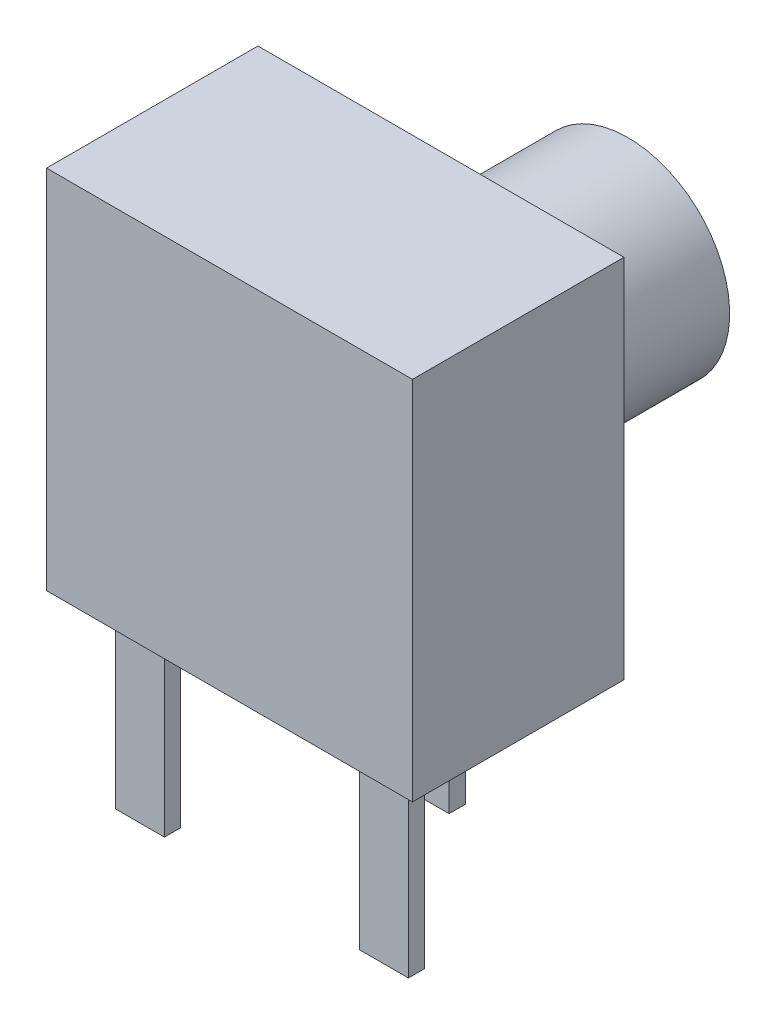
ISO-10303-21;
HEADER;
FILE_DESCRIPTION(('STEP AP214'),'2;1');
FILE_NAME('part.step','',(''),(''),'','','');
FILE_SCHEMA(('AUTOMOTIVE_DESIGN { 1 0 10303 214 1 1 1 1 }'));
ENDSEC;
DATA;
#1=APPLICATION_CONTEXT('core data for automotive mechanical design processes');
#2=APPLICATION_PROTOCOL_DEFINITION('international standard','automotive_design',2000,#1);
#3=PRODUCT_CONTEXT('',#1,'mechanical');
#4=PRODUCT('Part','Part','',(#3));
#5=PRODUCT_RELATED_PRODUCT_CATEGORY('part','',(#4));
#6=PRODUCT_DEFINITION_FORMATION('','',#4);
#7=PRODUCT_DEFINITION_CONTEXT('part definition',#1,'design');
#8=PRODUCT_DEFINITION('design','',#6,#7);
#9=PRODUCT_DEFINITION_SHAPE('','',#8);
#10=(LENGTH_UNIT() NAMED_UNIT(*) SI_UNIT(.MILLI.,.METRE.));
#11=(NAMED_UNIT(*) PLANE_ANGLE_UNIT() SI_UNIT($,.RADIAN.));
#12=(NAMED_UNIT(*) SI_UNIT($,.STERADIAN.) SOLID_ANGLE_UNIT());
#13=UNCERTAINTY_MEASURE_WITH_UNIT(LENGTH_MEASURE(1.E-05),#10,'distance_accuracy_value','');
#14=(GEOMETRIC_REPRESENTATION_CONTEXT(3) GLOBAL_UNCERTAINTY_ASSIGNED_CONTEXT((#13)) GLOBAL_UNIT_ASSIGNED_CONTEXT((#10,
#11,#12)) REPRESENTATION_CONTEXT('',''));
#15=CARTESIAN_POINT('',(0.,0.,0.));
#16=DIRECTION('',(0.,0.,1.));
#17=DIRECTION('',(1.,0.,0.));
#18=AXIS2_PLACEMENT_3D('',#15,#16,#17);
#19=CARTESIAN_POINT('',(-2.25,-2.25,2.6));
#20=DIRECTION('',(0.,1.,0.));
#21=DIRECTION('',(-1.,0.,0.));
#22=AXIS2_PLACEMENT_3D('',#19,#20,#21);
#23=PLANE('',#22);
#24=DIRECTION('',(0.,0.,1.));
#25=VECTOR('',#24,1.);
#26=CARTESIAN_POINT('',(1.8,-2.25,2.));
#27=LINE('',#26,#25);
#28=CARTESIAN_POINT('',(1.8,-2.25,2.));
#29=VERTEX_POINT('',#28);
#30=CARTESIAN_POINT('',(1.8,-2.25,2.2));
#31=VERTEX_POINT('',#30);
#32=EDGE_CURVE('E170',#29,#31,#27,.T.);
#33=ORIENTED_EDGE('',*,*,#32,.F.);
#34=DIRECTION('',(1.,0.,0.));
#35=VECTOR('',#34,1.);
#36=CARTESIAN_POINT('',(1.8,-2.25,2.));
#37=LINE('',#36,#35);
#38=CARTESIAN_POINT('',(1.2,-2.25,2.));
#39=VERTEX_POINT('',#38);
#40=EDGE_CURVE('E183',#39,#29,#37,.T.);
#41=ORIENTED_EDGE('',*,*,#40,.F.);
#42=DIRECTION('',(0.,0.,-1.));
#43=VECTOR('',#42,1.);
#44=CARTESIAN_POINT('',(1.2,-2.25,2.));
#45=LINE('',#44,#43);
#46=CARTESIAN_POINT('',(1.2,-2.25,2.2));
#47=VERTEX_POINT('',#46);
#48=EDGE_CURVE('E192',#47,#39,#45,.T.);
#49=ORIENTED_EDGE('',*,*,#48,.F.);
#50=DIRECTION('',(-1.,0.,0.));
#51=VECTOR('',#50,1.);
#52=CARTESIAN_POINT('',(1.8,-2.25,2.2));
#53=LINE('',#52,#51);
#54=EDGE_CURVE('E173',#31,#47,#53,.T.);
#55=ORIENTED_EDGE('',*,*,#54,.F.);
#56=EDGE_LOOP('',(#33,#41,#49,#55));
#57=FACE_BOUND('',#56,.T.);
#58=DIRECTION('',(0.,0.,1.));
#59=VECTOR('',#58,1.);
#60=CARTESIAN_POINT('',(0.3,-2.25,0.));
#61=LINE('',#60,#59);
#62=CARTESIAN_POINT('',(0.3,-2.25,0.));
#63=VERTEX_POINT('',#62);
#64=CARTESIAN_POINT('',(0.3,-2.25,0.2));
#65=VERTEX_POINT('',#64);
#66=EDGE_CURVE('E208',#63,#65,#61,.T.);
#67=ORIENTED_EDGE('',*,*,#66,.F.);
#68=DIRECTION('',(1.,0.,0.));
#69=VECTOR('',#68,1.);
#70=CARTESIAN_POINT('',(-2.25,-2.25,0.));
#71=LINE('',#70,#69);
#72=CARTESIAN_POINT('',(2.25,-2.25,0.));
#73=VERTEX_POINT('',#72);
#74=EDGE_CURVE('E255',#63,#73,#71,.T.);
#75=ORIENTED_EDGE('',*,*,#74,.T.);
#76=DIRECTION('',(0.,0.,-1.));
#77=VECTOR('',#76,1.);
#78=CARTESIAN_POINT('',(2.25,-2.25,2.6));
#79=LINE('',#78,#77);
#80=CARTESIAN_POINT('',(2.25,-2.25,2.6));
#81=VERTEX_POINT('',#80);
#82=EDGE_CURVE('E265',#81,#73,#79,.T.);
#83=ORIENTED_EDGE('',*,*,#82,.F.);
#84=DIRECTION('',(1.,0.,0.));
#85=VECTOR('',#84,1.);
#86=CARTESIAN_POINT('',(-2.25,-2.25,2.6));
#87=LINE('',#86,#85);
#88=CARTESIAN_POINT('',(-2.25,-2.25,2.6));
#89=VERTEX_POINT('',#88);
#90=EDGE_CURVE('E245',#89,#81,#87,.T.);
#91=ORIENTED_EDGE('',*,*,#90,.F.);
#92=DIRECTION('',(0.,0.,-1.));
#93=VECTOR('',#92,1.);
#94=CARTESIAN_POINT('',(-2.25,-2.25,2.6));
#95=LINE('',#94,#93);
#96=CARTESIAN_POINT('',(-2.25,-2.25,0.));
#97=VERTEX_POINT('',#96);
#98=EDGE_CURVE('E39',#89,#97,#95,.T.);
#99=ORIENTED_EDGE('',*,*,#98,.T.);
#100=CARTESIAN_POINT('',(-0.3,-2.25,0.));
#101=VERTEX_POINT('',#100);
#102=EDGE_CURVE('E256',#97,#101,#71,.T.);
#103=ORIENTED_EDGE('',*,*,#102,.T.);
#104=DIRECTION('',(0.,0.,-1.));
#105=VECTOR('',#104,1.);
#106=CARTESIAN_POINT('',(-0.3,-2.25,0.));
#107=LINE('',#106,#105);
#108=CARTESIAN_POINT('',(-0.3,-2.25,0.2));
#109=VERTEX_POINT('',#108);
#110=EDGE_CURVE('E213',#109,#101,#107,.T.);
#111=ORIENTED_EDGE('',*,*,#110,.F.);
#112=DIRECTION('',(-1.,0.,0.));
#113=VECTOR('',#112,1.);
#114=CARTESIAN_POINT('',(0.3,-2.25,0.2));
#115=LINE('',#114,#113);
#116=EDGE_CURVE('E222',#65,#109,#115,.T.);
#117=ORIENTED_EDGE('',*,*,#116,.F.);
#118=EDGE_LOOP('',(#67,#75,#83,#91,#99,#103,#111,#117));
#119=FACE_BOUND('',#118,.T.);
#120=DIRECTION('',(0.,0.,1.));
#121=VECTOR('',#120,1.);
#122=CARTESIAN_POINT('',(-1.2,-2.25,2.));
#123=LINE('',#122,#121);
#124=CARTESIAN_POINT('',(-1.2,-2.25,2.));
#125=VERTEX_POINT('',#124);
#126=CARTESIAN_POINT('',(-1.2,-2.25,2.2));
#127=VERTEX_POINT('',#126);
#128=EDGE_CURVE('E169',#125,#127,#123,.T.);
#129=ORIENTED_EDGE('',*,*,#128,.F.);
#130=DIRECTION('',(1.,0.,0.));
#131=VECTOR('',#130,1.);
#132=CARTESIAN_POINT('',(-1.2,-2.25,2.));
#133=LINE('',#132,#131);
#134=CARTESIAN_POINT('',(-1.8,-2.25,2.));
#135=VERTEX_POINT('',#134);
#136=EDGE_CURVE('E166',#135,#125,#133,.T.);
#137=ORIENTED_EDGE('',*,*,#136,.F.);
#138=DIRECTION('',(0.,0.,-1.));
#139=VECTOR('',#138,1.);
#140=CARTESIAN_POINT('',(-1.8,-2.25,2.));
#141=LINE('',#140,#139);
#142=CARTESIAN_POINT('',(-1.8,-2.25,2.2));
#143=VERTEX_POINT('',#142);
#144=EDGE_CURVE('E56',#143,#135,#141,.T.);
#145=ORIENTED_EDGE('',*,*,#144,.F.);
#146=DIRECTION('',(-1.,0.,0.));
#147=VECTOR('',#146,1.);
#148=CARTESIAN_POINT('',(-1.2,-2.25,2.2));
#149=LINE('',#148,#147);
#150=EDGE_CURVE('E51',#127,#143,#149,.T.);
#151=ORIENTED_EDGE('',*,*,#150,.F.);
#152=EDGE_LOOP('',(#129,#137,#145,#151));
#153=FACE_BOUND('',#152,.T.);
#154=ADVANCED_FACE('F35',(#57,#119,#153),#23,.F.);
#155=CARTESIAN_POINT('',(-2.25,2.25,2.6));
#156=DIRECTION('',(1.,0.,0.));
#157=DIRECTION('',(0.,1.,0.));
#158=AXIS2_PLACEMENT_3D('',#155,#156,#157);
#159=PLANE('',#158);
#160=DIRECTION('',(0.,-1.,0.));
#161=VECTOR('',#160,1.);
#162=CARTESIAN_POINT('',(-2.25,2.25,0.));
#163=LINE('',#162,#161);
#164=CARTESIAN_POINT('',(-2.25,2.25,0.));
#165=VERTEX_POINT('',#164);
#166=EDGE_CURVE('E240',#165,#97,#163,.T.);
#167=ORIENTED_EDGE('',*,*,#166,.T.);
#168=ORIENTED_EDGE('',*,*,#98,.F.);
#169=DIRECTION('',(0.,-1.,0.));
#170=VECTOR('',#169,1.);
#171=CARTESIAN_POINT('',(-2.25,2.25,2.6));
#172=LINE('',#171,#170);
#173=CARTESIAN_POINT('',(-2.25,2.25,2.6));
#174=VERTEX_POINT('',#173);
#175=EDGE_CURVE('E242',#174,#89,#172,.T.);
#176=ORIENTED_EDGE('',*,*,#175,.F.);
#177=DIRECTION('',(0.,0.,-1.));
#178=VECTOR('',#177,1.);
#179=CARTESIAN_POINT('',(-2.25,2.25,2.6));
#180=LINE('',#179,#178);
#181=EDGE_CURVE('E252',#174,#165,#180,.T.);
#182=ORIENTED_EDGE('',*,*,#181,.T.);
#183=EDGE_LOOP('',(#167,#168,#176,#182));
#184=FACE_BOUND('',#183,.T.);
#185=ADVANCED_FACE('F37',(#184),#159,.F.);
#186=CARTESIAN_POINT('',(2.25,2.25,2.6));
#187=DIRECTION('',(-1.,0.,0.));
#188=DIRECTION('',(0.,-1.,0.));
#189=AXIS2_PLACEMENT_3D('',#186,#187,#188);
#190=PLANE('',#189);
#191=DIRECTION('',(0.,1.,0.));
#192=VECTOR('',#191,1.);
#193=CARTESIAN_POINT('',(2.25,2.25,0.));
#194=LINE('',#193,#192);
#195=CARTESIAN_POINT('',(2.25,2.25,0.));
#196=VERTEX_POINT('',#195);
#197=EDGE_CURVE('E258',#73,#196,#194,.T.);
#198=ORIENTED_EDGE('',*,*,#197,.T.);
#199=DIRECTION('',(0.,0.,-1.));
#200=VECTOR('',#199,1.);
#201=CARTESIAN_POINT('',(2.25,2.25,2.6));
#202=LINE('',#201,#200);
#203=CARTESIAN_POINT('',(2.25,2.25,2.6));
#204=VERTEX_POINT('',#203);
#205=EDGE_CURVE('E263',#204,#196,#202,.T.);
#206=ORIENTED_EDGE('',*,*,#205,.F.);
#207=DIRECTION('',(0.,1.,0.));
#208=VECTOR('',#207,1.);
#209=CARTESIAN_POINT('',(2.25,2.25,2.6));
#210=LINE('',#209,#208);
#211=EDGE_CURVE('E248',#81,#204,#210,.T.);
#212=ORIENTED_EDGE('',*,*,#211,.F.);
#213=ORIENTED_EDGE('',*,*,#82,.T.);
#214=EDGE_LOOP('',(#198,#206,#212,#213));
#215=FACE_BOUND('',#214,.T.);
#216=ADVANCED_FACE('F296',(#215),#190,.F.);
#217=CARTESIAN_POINT('',(-2.25,2.25,2.6));
#218=DIRECTION('',(0.,-1.,0.));
#219=DIRECTION('',(1.,0.,0.));
#220=AXIS2_PLACEMENT_3D('',#217,#218,#219);
#221=PLANE('',#220);
#222=DIRECTION('',(-1.,0.,0.));
#223=VECTOR('',#222,1.);
#224=CARTESIAN_POINT('',(-2.25,2.25,0.));
#225=LINE('',#224,#223);
#226=EDGE_CURVE('E246',#196,#165,#225,.T.);
#227=ORIENTED_EDGE('',*,*,#226,.T.);
#228=ORIENTED_EDGE('',*,*,#181,.F.);
#229=DIRECTION('',(-1.,0.,0.));
#230=VECTOR('',#229,1.);
#231=CARTESIAN_POINT('',(-2.25,2.25,2.6));
#232=LINE('',#231,#230);
#233=EDGE_CURVE('E250',#204,#174,#232,.T.);
#234=ORIENTED_EDGE('',*,*,#233,.F.);
#235=ORIENTED_EDGE('',*,*,#205,.T.);
#236=EDGE_LOOP('',(#227,#228,#234,#235));
#237=FACE_BOUND('',#236,.T.);
#238=ADVANCED_FACE('F299',(#237),#221,.F.);
#239=CARTESIAN_POINT('',(0.,0.,2.6));
#240=DIRECTION('',(0.,0.,1.));
#241=DIRECTION('',(1.,0.,0.));
#242=AXIS2_PLACEMENT_3D('',#239,#240,#241);
#243=PLANE('',#242);
#244=ORIENTED_EDGE('',*,*,#175,.T.);
#245=ORIENTED_EDGE('',*,*,#90,.T.);
#246=ORIENTED_EDGE('',*,*,#211,.T.);
#247=ORIENTED_EDGE('',*,*,#233,.T.);
#248=EDGE_LOOP('',(#244,#245,#246,#247));
#249=FACE_BOUND('',#248,.T.);
#250=ADVANCED_FACE('F301',(#249),#243,.T.);
#251=CARTESIAN_POINT('',(0.,0.,0.));
#252=DIRECTION('',(0.,0.,1.));
#253=DIRECTION('',(1.,0.,0.));
#254=AXIS2_PLACEMENT_3D('',#251,#252,#253);
#255=PLANE('',#254);
#256=CARTESIAN_POINT('',(0.,0.,0.));
#257=DIRECTION('',(0.,0.,-1.));
#258=DIRECTION('',(-1.,0.,0.));
#259=AXIS2_PLACEMENT_3D('',#256,#257,#258);
#260=CIRCLE('',#259,1.25);
#261=CARTESIAN_POINT('',(-1.25,0.,0.));
#262=VERTEX_POINT('',#261);
#263=EDGE_CURVE('E11',#262,#262,#260,.T.);
#264=ORIENTED_EDGE('',*,*,#263,.F.);
#265=EDGE_LOOP('',(#264));
#266=FACE_BOUND('',#265,.T.);
#267=ORIENTED_EDGE('',*,*,#166,.F.);
#268=ORIENTED_EDGE('',*,*,#226,.F.);
#269=ORIENTED_EDGE('',*,*,#197,.F.);
#270=ORIENTED_EDGE('',*,*,#74,.F.);
#271=DIRECTION('',(0.,1.,0.));
#272=VECTOR('',#271,1.);
#273=CARTESIAN_POINT('',(0.3,-4.55,0.));
#274=LINE('',#273,#272);
#275=CARTESIAN_POINT('',(0.3,-4.55,0.));
#276=VERTEX_POINT('',#275);
#277=EDGE_CURVE('E219',#276,#63,#274,.T.);
#278=ORIENTED_EDGE('',*,*,#277,.F.);
#279=DIRECTION('',(1.,0.,0.));
#280=VECTOR('',#279,1.);
#281=CARTESIAN_POINT('',(0.3,-4.55,0.));
#282=LINE('',#281,#280);
#283=CARTESIAN_POINT('',(-0.299999999999999,-4.55,0.));
#284=VERTEX_POINT('',#283);
#285=EDGE_CURVE('E217',#284,#276,#282,.T.);
#286=ORIENTED_EDGE('',*,*,#285,.F.);
#287=DIRECTION('',(0.,1.,0.));
#288=VECTOR('',#287,1.);
#289=CARTESIAN_POINT('',(-0.299999999999999,-4.55,0.));
#290=LINE('',#289,#288);
#291=EDGE_CURVE('E229',#284,#101,#290,.T.);
#292=ORIENTED_EDGE('',*,*,#291,.T.);
#293=ORIENTED_EDGE('',*,*,#102,.F.);
#294=EDGE_LOOP('',(#267,#268,#269,#270,#278,#286,#292,#293));
#295=FACE_BOUND('',#294,.T.);
#296=ADVANCED_FACE('F280',(#266,#295),#255,.F.);
#297=CARTESIAN_POINT('',(0.,0.,-2.3));
#298=DIRECTION('',(0.,0.,1.));
#299=DIRECTION('',(1.,0.,0.));
#300=AXIS2_PLACEMENT_3D('',#297,#298,#299);
#301=CYLINDRICAL_SURFACE('',#300,1.25);
#302=CARTESIAN_POINT('',(0.,0.,-2.3));
#303=DIRECTION('',(0.,0.,-1.));
#304=DIRECTION('',(-1.,0.,0.));
#305=AXIS2_PLACEMENT_3D('',#302,#303,#304);
#306=CIRCLE('',#305,1.25);
#307=CARTESIAN_POINT('',(-1.25,0.,-2.3));
#308=VERTEX_POINT('',#307);
#309=EDGE_CURVE('E238',#308,#308,#306,.T.);
#310=ORIENTED_EDGE('',*,*,#309,.F.);
#311=EDGE_LOOP('',(#310));
#312=FACE_BOUND('',#311,.T.);
#313=ORIENTED_EDGE('',*,*,#263,.T.);
#314=EDGE_LOOP('',(#313));
#315=FACE_BOUND('',#314,.T.);
#316=ADVANCED_FACE('F308',(#312,#315),#301,.T.);
#317=CARTESIAN_POINT('',(0.,0.,-2.3));
#318=DIRECTION('',(0.,0.,-1.));
#319=DIRECTION('',(-1.,0.,0.));
#320=AXIS2_PLACEMENT_3D('',#317,#318,#319);
#321=PLANE('',#320);
#322=ORIENTED_EDGE('',*,*,#309,.T.);
#323=EDGE_LOOP('',(#322));
#324=FACE_BOUND('',#323,.T.);
#325=ADVANCED_FACE('F342',(#324),#321,.T.);
#326=CARTESIAN_POINT('',(0.3,-4.55,0.));
#327=DIRECTION('',(-1.,0.,0.));
#328=DIRECTION('',(0.,0.,1.));
#329=AXIS2_PLACEMENT_3D('',#326,#327,#328);
#330=PLANE('',#329);
#331=ORIENTED_EDGE('',*,*,#66,.T.);
#332=DIRECTION('',(0.,1.,0.));
#333=VECTOR('',#332,1.);
#334=CARTESIAN_POINT('',(0.3,-4.55,0.2));
#335=LINE('',#334,#333);
#336=CARTESIAN_POINT('',(0.3,-4.55,0.2));
#337=VERTEX_POINT('',#336);
#338=EDGE_CURVE('E235',#337,#65,#335,.T.);
#339=ORIENTED_EDGE('',*,*,#338,.F.);
#340=DIRECTION('',(0.,0.,1.));
#341=VECTOR('',#340,1.);
#342=CARTESIAN_POINT('',(0.3,-4.55,0.));
#343=LINE('',#342,#341);
#344=EDGE_CURVE('E209',#276,#337,#343,.T.);
#345=ORIENTED_EDGE('',*,*,#344,.F.);
#346=ORIENTED_EDGE('',*,*,#277,.T.);
#347=EDGE_LOOP('',(#331,#339,#345,#346));
#348=FACE_BOUND('',#347,.T.);
#349=ADVANCED_FACE('F293',(#348),#330,.F.);
#350=CARTESIAN_POINT('',(0.3,-4.55,0.2));
#351=DIRECTION('',(0.,0.,-1.));
#352=DIRECTION('',(-1.,0.,0.));
#353=AXIS2_PLACEMENT_3D('',#350,#351,#352);
#354=PLANE('',#353);
#355=ORIENTED_EDGE('',*,*,#116,.T.);
#356=DIRECTION('',(0.,1.,0.));
#357=VECTOR('',#356,1.);
#358=CARTESIAN_POINT('',(-0.299999999999999,-4.55,0.2));
#359=LINE('',#358,#357);
#360=CARTESIAN_POINT('',(-0.299999999999999,-4.55,0.2));
#361=VERTEX_POINT('',#360);
#362=EDGE_CURVE('E232',#361,#109,#359,.T.);
#363=ORIENTED_EDGE('',*,*,#362,.F.);
#364=DIRECTION('',(-1.,0.,0.));
#365=VECTOR('',#364,1.);
#366=CARTESIAN_POINT('',(0.3,-4.55,0.2));
#367=LINE('',#366,#365);
#368=EDGE_CURVE('E212',#337,#361,#367,.T.);
#369=ORIENTED_EDGE('',*,*,#368,.F.);
#370=ORIENTED_EDGE('',*,*,#338,.T.);
#371=EDGE_LOOP('',(#355,#363,#369,#370));
#372=FACE_BOUND('',#371,.T.);
#373=ADVANCED_FACE('F289',(#372),#354,.F.);
#374=CARTESIAN_POINT('',(-0.299999999999999,-4.55,0.));
#375=DIRECTION('',(1.,0.,0.));
#376=DIRECTION('',(0.,1.,0.));
#377=AXIS2_PLACEMENT_3D('',#374,#375,#376);
#378=PLANE('',#377);
#379=ORIENTED_EDGE('',*,*,#110,.T.);
#380=ORIENTED_EDGE('',*,*,#291,.F.);
#381=DIRECTION('',(0.,0.,-1.));
#382=VECTOR('',#381,1.);
#383=CARTESIAN_POINT('',(-0.299999999999999,-4.55,0.));
#384=LINE('',#383,#382);
#385=EDGE_CURVE('E215',#361,#284,#384,.T.);
#386=ORIENTED_EDGE('',*,*,#385,.F.);
#387=ORIENTED_EDGE('',*,*,#362,.T.);
#388=EDGE_LOOP('',(#379,#380,#386,#387));
#389=FACE_BOUND('',#388,.T.);
#390=ADVANCED_FACE('F286',(#389),#378,.F.);
#391=CARTESIAN_POINT('',(0.,-4.55,0.));
#392=DIRECTION('',(0.,-1.,0.));
#393=DIRECTION('',(0.,0.,-1.));
#394=AXIS2_PLACEMENT_3D('',#391,#392,#393);
#395=PLANE('',#394);
#396=ORIENTED_EDGE('',*,*,#344,.T.);
#397=ORIENTED_EDGE('',*,*,#368,.T.);
#398=ORIENTED_EDGE('',*,*,#385,.T.);
#399=ORIENTED_EDGE('',*,*,#285,.T.);
#400=EDGE_LOOP('',(#396,#397,#398,#399));
#401=FACE_BOUND('',#400,.T.);
#402=ADVANCED_FACE('F386',(#401),#395,.T.);
#403=CARTESIAN_POINT('',(1.8,-4.55,2.));
#404=DIRECTION('',(-1.,0.,0.));
#405=DIRECTION('',(0.,-1.,0.));
#406=AXIS2_PLACEMENT_3D('',#403,#404,#405);
#407=PLANE('',#406);
#408=ORIENTED_EDGE('',*,*,#32,.T.);
#409=DIRECTION('',(0.,1.,0.));
#410=VECTOR('',#409,1.);
#411=CARTESIAN_POINT('',(1.8,-4.55,2.2));
#412=LINE('',#411,#410);
#413=CARTESIAN_POINT('',(1.8,-4.55,2.2));
#414=VERTEX_POINT('',#413);
#415=EDGE_CURVE('E205',#414,#31,#412,.T.);
#416=ORIENTED_EDGE('',*,*,#415,.F.);
#417=DIRECTION('',(0.,0.,1.));
#418=VECTOR('',#417,1.);
#419=CARTESIAN_POINT('',(1.8,-4.55,2.));
#420=LINE('',#419,#418);
#421=CARTESIAN_POINT('',(1.8,-4.55,2.));
#422=VERTEX_POINT('',#421);
#423=EDGE_CURVE('E179',#422,#414,#420,.T.);
#424=ORIENTED_EDGE('',*,*,#423,.F.);
#425=DIRECTION('',(0.,1.,0.));
#426=VECTOR('',#425,1.);
#427=CARTESIAN_POINT('',(1.8,-4.55,2.));
#428=LINE('',#427,#426);
#429=EDGE_CURVE('E188',#422,#29,#428,.T.);
#430=ORIENTED_EDGE('',*,*,#429,.T.);
#431=EDGE_LOOP('',(#408,#416,#424,#430));
#432=FACE_BOUND('',#431,.T.);
#433=ADVANCED_FACE('F395',(#432),#407,.F.);
#434=CARTESIAN_POINT('',(1.8,-4.55,2.2));
#435=DIRECTION('',(0.,0.,-1.));
#436=DIRECTION('',(-1.,0.,0.));
#437=AXIS2_PLACEMENT_3D('',#434,#435,#436);
#438=PLANE('',#437);
#439=ORIENTED_EDGE('',*,*,#54,.T.);
#440=DIRECTION('',(0.,1.,0.));
#441=VECTOR('',#440,1.);
#442=CARTESIAN_POINT('',(1.2,-4.55,2.2));
#443=LINE('',#442,#441);
#444=CARTESIAN_POINT('',(1.2,-4.55,2.2));
#445=VERTEX_POINT('',#444);
#446=EDGE_CURVE('E202',#445,#47,#443,.T.);
#447=ORIENTED_EDGE('',*,*,#446,.F.);
#448=DIRECTION('',(-1.,0.,0.));
#449=VECTOR('',#448,1.);
#450=CARTESIAN_POINT('',(1.8,-4.55,2.2));
#451=LINE('',#450,#449);
#452=EDGE_CURVE('E182',#414,#445,#451,.T.);
#453=ORIENTED_EDGE('',*,*,#452,.F.);
#454=ORIENTED_EDGE('',*,*,#415,.T.);
#455=EDGE_LOOP('',(#439,#447,#453,#454));
#456=FACE_BOUND('',#455,.T.);
#457=ADVANCED_FACE('F405',(#456),#438,.F.);
#458=CARTESIAN_POINT('',(1.2,-4.55,2.));
#459=DIRECTION('',(1.,0.,0.));
#460=DIRECTION('',(0.,1.,0.));
#461=AXIS2_PLACEMENT_3D('',#458,#459,#460);
#462=PLANE('',#461);
#463=ORIENTED_EDGE('',*,*,#48,.T.);
#464=DIRECTION('',(0.,1.,0.));
#465=VECTOR('',#464,1.);
#466=CARTESIAN_POINT('',(1.2,-4.55,2.));
#467=LINE('',#466,#465);
#468=CARTESIAN_POINT('',(1.2,-4.55,2.));
#469=VERTEX_POINT('',#468);
#470=EDGE_CURVE('E199',#469,#39,#467,.T.);
#471=ORIENTED_EDGE('',*,*,#470,.F.);
#472=DIRECTION('',(0.,0.,-1.));
#473=VECTOR('',#472,1.);
#474=CARTESIAN_POINT('',(1.2,-4.55,2.));
#475=LINE('',#474,#473);
#476=EDGE_CURVE('E185',#445,#469,#475,.T.);
#477=ORIENTED_EDGE('',*,*,#476,.F.);
#478=ORIENTED_EDGE('',*,*,#446,.T.);
#479=EDGE_LOOP('',(#463,#471,#477,#478));
#480=FACE_BOUND('',#479,.T.);
#481=ADVANCED_FACE('F415',(#480),#462,.F.);
#482=CARTESIAN_POINT('',(1.8,-4.55,2.));
#483=DIRECTION('',(0.,0.,1.));
#484=DIRECTION('',(1.,0.,0.));
#485=AXIS2_PLACEMENT_3D('',#482,#483,#484);
#486=PLANE('',#485);
#487=ORIENTED_EDGE('',*,*,#40,.T.);
#488=ORIENTED_EDGE('',*,*,#429,.F.);
#489=DIRECTION('',(1.,0.,0.));
#490=VECTOR('',#489,1.);
#491=CARTESIAN_POINT('',(1.8,-4.55,2.));
#492=LINE('',#491,#490);
#493=EDGE_CURVE('E187',#469,#422,#492,.T.);
#494=ORIENTED_EDGE('',*,*,#493,.F.);
#495=ORIENTED_EDGE('',*,*,#470,.T.);
#496=EDGE_LOOP('',(#487,#488,#494,#495));
#497=FACE_BOUND('',#496,.T.);
#498=ADVANCED_FACE('F425',(#497),#486,.F.);
#499=CARTESIAN_POINT('',(0.,-4.55,0.));
#500=DIRECTION('',(0.,-1.,0.));
#501=DIRECTION('',(0.,0.,-1.));
#502=AXIS2_PLACEMENT_3D('',#499,#500,#501);
#503=PLANE('',#502);
#504=ORIENTED_EDGE('',*,*,#423,.T.);
#505=ORIENTED_EDGE('',*,*,#452,.T.);
#506=ORIENTED_EDGE('',*,*,#476,.T.);
#507=ORIENTED_EDGE('',*,*,#493,.T.);
#508=EDGE_LOOP('',(#504,#505,#506,#507));
#509=FACE_BOUND('',#508,.T.);
#510=ADVANCED_FACE('F435',(#509),#503,.T.);
#511=CARTESIAN_POINT('',(-1.2,-4.55,2.));
#512=DIRECTION('',(-1.,0.,0.));
#513=DIRECTION('',(0.,-1.,0.));
#514=AXIS2_PLACEMENT_3D('',#511,#512,#513);
#515=PLANE('',#514);
#516=ORIENTED_EDGE('',*,*,#128,.T.);
#517=DIRECTION('',(0.,1.,0.));
#518=VECTOR('',#517,1.);
#519=CARTESIAN_POINT('',(-1.2,-4.55,2.2));
#520=LINE('',#519,#518);
#521=CARTESIAN_POINT('',(-1.2,-4.55,2.2));
#522=VERTEX_POINT('',#521);
#523=EDGE_CURVE('E150',#522,#127,#520,.T.);
#524=ORIENTED_EDGE('',*,*,#523,.F.);
#525=DIRECTION('',(0.,0.,1.));
#526=VECTOR('',#525,1.);
#527=CARTESIAN_POINT('',(-1.2,-4.55,2.));
#528=LINE('',#527,#526);
#529=CARTESIAN_POINT('',(-1.2,-4.55,2.));
#530=VERTEX_POINT('',#529);
#531=EDGE_CURVE('E157',#530,#522,#528,.T.);
#532=ORIENTED_EDGE('',*,*,#531,.F.);
#533=DIRECTION('',(0.,1.,0.));
#534=VECTOR('',#533,1.);
#535=CARTESIAN_POINT('',(-1.2,-4.55,2.));
#536=LINE('',#535,#534);
#537=EDGE_CURVE('E495',#530,#125,#536,.T.);
#538=ORIENTED_EDGE('',*,*,#537,.T.);
#539=EDGE_LOOP('',(#516,#524,#532,#538));
#540=FACE_BOUND('',#539,.T.);
#541=ADVANCED_FACE('F168',(#540),#515,.F.);
#542=CARTESIAN_POINT('',(-1.2,-4.55,2.2));
#543=DIRECTION('',(0.,0.,-1.));
#544=DIRECTION('',(-1.,0.,0.));
#545=AXIS2_PLACEMENT_3D('',#542,#543,#544);
#546=PLANE('',#545);
#547=ORIENTED_EDGE('',*,*,#150,.T.);
#548=DIRECTION('',(0.,1.,0.));
#549=VECTOR('',#548,1.);
#550=CARTESIAN_POINT('',(-1.8,-4.55,2.2));
#551=LINE('',#550,#549);
#552=CARTESIAN_POINT('',(-1.8,-4.55,2.2));
#553=VERTEX_POINT('',#552);
#554=EDGE_CURVE('E153',#553,#143,#551,.T.);
#555=ORIENTED_EDGE('',*,*,#554,.F.);
#556=DIRECTION('',(-1.,0.,0.));
#557=VECTOR('',#556,1.);
#558=CARTESIAN_POINT('',(-1.2,-4.55,2.2));
#559=LINE('',#558,#557);
#560=EDGE_CURVE('E146',#522,#553,#559,.T.);
#561=ORIENTED_EDGE('',*,*,#560,.F.);
#562=ORIENTED_EDGE('',*,*,#523,.T.);
#563=EDGE_LOOP('',(#547,#555,#561,#562));
#564=FACE_BOUND('',#563,.T.);
#565=ADVANCED_FACE('F148',(#564),#546,.F.);
#566=CARTESIAN_POINT('',(-1.8,-4.55,2.));
#567=DIRECTION('',(1.,0.,0.));
#568=DIRECTION('',(0.,1.,0.));
#569=AXIS2_PLACEMENT_3D('',#566,#567,#568);
#570=PLANE('',#569);
#571=ORIENTED_EDGE('',*,*,#144,.T.);
#572=DIRECTION('',(0.,1.,0.));
#573=VECTOR('',#572,1.);
#574=CARTESIAN_POINT('',(-1.8,-4.55,2.));
#575=LINE('',#574,#573);
#576=CARTESIAN_POINT('',(-1.8,-4.55,2.));
#577=VERTEX_POINT('',#576);
#578=EDGE_CURVE('E175',#577,#135,#575,.T.);
#579=ORIENTED_EDGE('',*,*,#578,.F.);
#580=DIRECTION('',(0.,0.,-1.));
#581=VECTOR('',#580,1.);
#582=CARTESIAN_POINT('',(-1.8,-4.55,2.));
#583=LINE('',#582,#581);
#584=EDGE_CURVE('E156',#553,#577,#583,.T.);
#585=ORIENTED_EDGE('',*,*,#584,.F.);
#586=ORIENTED_EDGE('',*,*,#554,.T.);
#587=EDGE_LOOP('',(#571,#579,#585,#586));
#588=FACE_BOUND('',#587,.T.);
#589=ADVANCED_FACE('F462',(#588),#570,.F.);
#590=CARTESIAN_POINT('',(-1.2,-4.55,2.));
#591=DIRECTION('',(0.,0.,1.));
#592=DIRECTION('',(1.,0.,0.));
#593=AXIS2_PLACEMENT_3D('',#590,#591,#592);
#594=PLANE('',#593);
#595=ORIENTED_EDGE('',*,*,#136,.T.);
#596=ORIENTED_EDGE('',*,*,#537,.F.);
#597=DIRECTION('',(1.,0.,0.));
#598=VECTOR('',#597,1.);
#599=CARTESIAN_POINT('',(-1.2,-4.55,2.));
#600=LINE('',#599,#598);
#601=EDGE_CURVE('E162',#577,#530,#600,.T.);
#602=ORIENTED_EDGE('',*,*,#601,.F.);
#603=ORIENTED_EDGE('',*,*,#578,.T.);
#604=EDGE_LOOP('',(#595,#596,#602,#603));
#605=FACE_BOUND('',#604,.T.);
#606=ADVANCED_FACE('F471',(#605),#594,.F.);
#607=CARTESIAN_POINT('',(0.,-4.55,0.));
#608=DIRECTION('',(0.,-1.,0.));
#609=DIRECTION('',(0.,0.,-1.));
#610=AXIS2_PLACEMENT_3D('',#607,#608,#609);
#611=PLANE('',#610);
#612=ORIENTED_EDGE('',*,*,#531,.T.);
#613=ORIENTED_EDGE('',*,*,#560,.T.);
#614=ORIENTED_EDGE('',*,*,#584,.T.);
#615=ORIENTED_EDGE('',*,*,#601,.T.);
#616=EDGE_LOOP('',(#612,#613,#614,#615));
#617=FACE_BOUND('',#616,.T.);
#618=ADVANCED_FACE('F160',(#617),#611,.T.);
#619=CLOSED_SHELL('',(#154,#185,#216,#238,#250,#296,#316,#325,#349,#373,#390,#402,#433,#457,
#481,#498,#510,#541,#565,#589,#606,#618));
#620=MANIFOLD_SOLID_BREP('B2',#619);
#621=ADVANCED_BREP_SHAPE_REPRESENTATION('',(#18,#620),#14);
#622=SHAPE_DEFINITION_REPRESENTATION(#9,#621);
ENDSEC;
END-ISO-10303-21;
